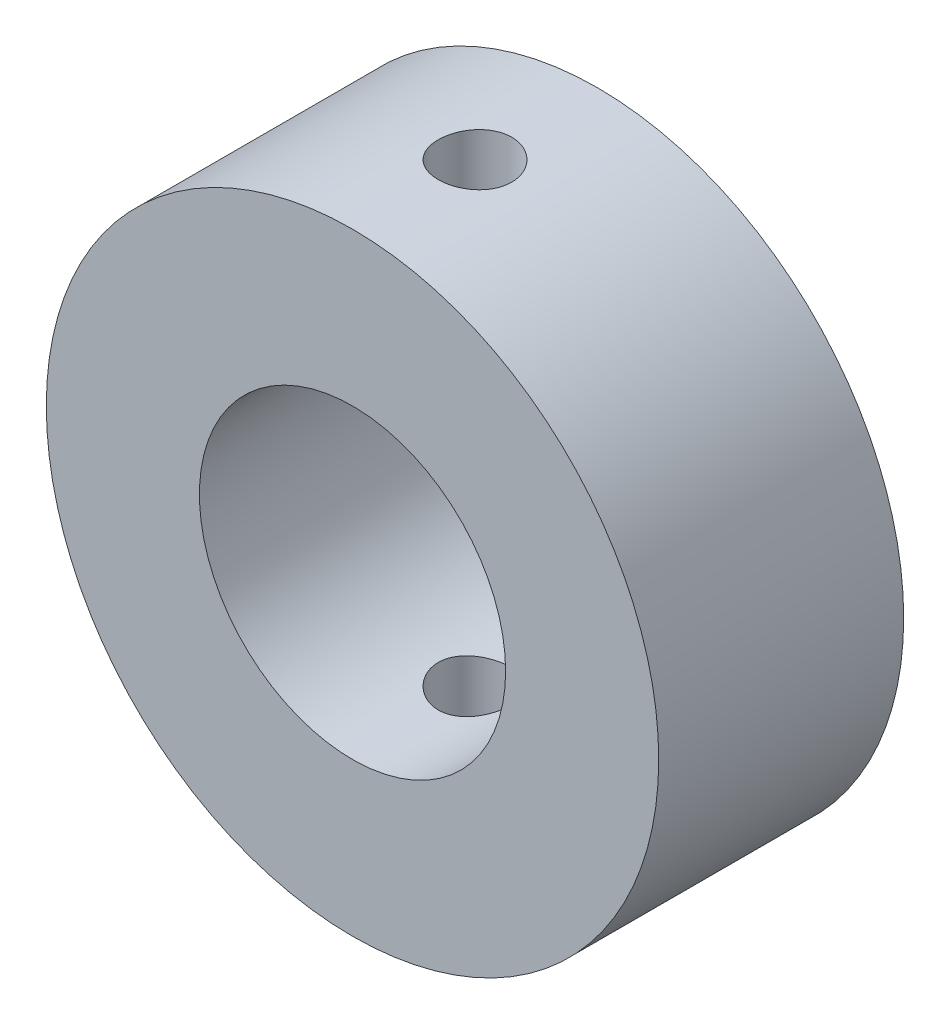
ISO-10303-21;
HEADER;
FILE_DESCRIPTION(('STEP AP214'),'2;1');
FILE_NAME('part.step','',(''),(''),'','','');
FILE_SCHEMA(('AUTOMOTIVE_DESIGN { 1 0 10303 214 1 1 1 1 }'));
ENDSEC;
DATA;
#1=APPLICATION_CONTEXT('core data for automotive mechanical design processes');
#2=APPLICATION_PROTOCOL_DEFINITION('international standard','automotive_design',2000,#1);
#3=PRODUCT_CONTEXT('',#1,'mechanical');
#4=PRODUCT('Part','Part','',(#3));
#5=PRODUCT_RELATED_PRODUCT_CATEGORY('part','',(#4));
#6=PRODUCT_DEFINITION_FORMATION('','',#4);
#7=PRODUCT_DEFINITION_CONTEXT('part definition',#1,'design');
#8=PRODUCT_DEFINITION('design','',#6,#7);
#9=PRODUCT_DEFINITION_SHAPE('','',#8);
#10=(LENGTH_UNIT() NAMED_UNIT(*) SI_UNIT(.MILLI.,.METRE.));
#11=(NAMED_UNIT(*) PLANE_ANGLE_UNIT() SI_UNIT($,.RADIAN.));
#12=(NAMED_UNIT(*) SI_UNIT($,.STERADIAN.) SOLID_ANGLE_UNIT());
#13=UNCERTAINTY_MEASURE_WITH_UNIT(LENGTH_MEASURE(1.E-05),#10,'distance_accuracy_value','');
#14=(GEOMETRIC_REPRESENTATION_CONTEXT(3) GLOBAL_UNCERTAINTY_ASSIGNED_CONTEXT((#13)) GLOBAL_UNIT_ASSIGNED_CONTEXT((#10,
#11,#12)) REPRESENTATION_CONTEXT('',''));
#15=CARTESIAN_POINT('',(0.,0.,0.));
#16=DIRECTION('',(0.,0.,1.));
#17=DIRECTION('',(1.,0.,0.));
#18=AXIS2_PLACEMENT_3D('',#15,#16,#17);
#19=CARTESIAN_POINT('',(0.,0.,20.));
#20=DIRECTION('',(0.,0.,1.));
#21=DIRECTION('',(1.,0.,0.));
#22=AXIS2_PLACEMENT_3D('',#19,#20,#21);
#23=PLANE('',#22);
#24=CARTESIAN_POINT('',(0.,0.,20.));
#25=DIRECTION('',(0.,0.,1.));
#26=DIRECTION('',(1.,0.,0.));
#27=AXIS2_PLACEMENT_3D('',#24,#25,#26);
#28=CIRCLE('',#27,25.);
#29=CARTESIAN_POINT('',(25.,0.,20.));
#30=VERTEX_POINT('',#29);
#31=EDGE_CURVE('E10',#30,#30,#28,.T.);
#32=ORIENTED_EDGE('',*,*,#31,.T.);
#33=EDGE_LOOP('',(#32));
#34=FACE_BOUND('',#33,.T.);
#35=CARTESIAN_POINT('',(0.,0.,20.));
#36=DIRECTION('',(0.,0.,1.));
#37=DIRECTION('',(1.,0.,0.));
#38=AXIS2_PLACEMENT_3D('',#35,#36,#37);
#39=CIRCLE('',#38,12.5);
#40=CARTESIAN_POINT('',(12.5,0.,20.));
#41=VERTEX_POINT('',#40);
#42=EDGE_CURVE('E51',#41,#41,#39,.T.);
#43=ORIENTED_EDGE('',*,*,#42,.F.);
#44=EDGE_LOOP('',(#43));
#45=FACE_BOUND('',#44,.T.);
#46=ADVANCED_FACE('F32',(#34,#45),#23,.T.);
#47=CARTESIAN_POINT('',(0.,0.,0.));
#48=DIRECTION('',(0.,0.,1.));
#49=DIRECTION('',(1.,0.,0.));
#50=AXIS2_PLACEMENT_3D('',#47,#48,#49);
#51=PLANE('',#50);
#52=CARTESIAN_POINT('',(0.,0.,0.));
#53=DIRECTION('',(0.,0.,1.));
#54=DIRECTION('',(1.,0.,0.));
#55=AXIS2_PLACEMENT_3D('',#52,#53,#54);
#56=CIRCLE('',#55,25.);
#57=CARTESIAN_POINT('',(25.,0.,0.));
#58=VERTEX_POINT('',#57);
#59=EDGE_CURVE('E46',#58,#58,#56,.T.);
#60=ORIENTED_EDGE('',*,*,#59,.F.);
#61=EDGE_LOOP('',(#60));
#62=FACE_BOUND('',#61,.T.);
#63=CARTESIAN_POINT('',(0.,0.,0.));
#64=DIRECTION('',(0.,0.,1.));
#65=DIRECTION('',(1.,0.,0.));
#66=AXIS2_PLACEMENT_3D('',#63,#64,#65);
#67=CIRCLE('',#66,12.5);
#68=CARTESIAN_POINT('',(12.5,0.,0.));
#69=VERTEX_POINT('',#68);
#70=EDGE_CURVE('E54',#69,#69,#67,.T.);
#71=ORIENTED_EDGE('',*,*,#70,.T.);
#72=EDGE_LOOP('',(#71));
#73=FACE_BOUND('',#72,.T.);
#74=ADVANCED_FACE('F90',(#62,#73),#51,.F.);
#75=CARTESIAN_POINT('',(0.,0.,20.));
#76=DIRECTION('',(0.,0.,-1.));
#77=DIRECTION('',(-1.,0.,0.));
#78=AXIS2_PLACEMENT_3D('',#75,#76,#77);
#79=CYLINDRICAL_SURFACE('',#78,25.);
#80=CARTESIAN_POINT('',(0.,-25.,13.));
#81=CARTESIAN_POINT('',(0.167864047107699,-24.9999977357459,12.9999928360586));
#82=CARTESIAN_POINT('',(0.335834317331191,-24.9982914200408,12.9858633413073));
#83=CARTESIAN_POINT('',(0.66710457130825,-24.991648705422,12.9297189358446));
#84=CARTESIAN_POINT('',(0.830399429590069,-24.9867088933728,12.8876745587494));
#85=CARTESIAN_POINT('',(1.14747479534053,-24.9741559265426,12.776953723474));
#86=CARTESIAN_POINT('',(1.30126148759225,-24.9665445315309,12.7082947931758));
#87=CARTESIAN_POINT('',(1.595099157832,-24.9494959264345,12.5463312649167));
#88=CARTESIAN_POINT('',(1.73515256713516,-24.9400590404141,12.4530310402467));
#89=CARTESIAN_POINT('',(1.99829131534451,-24.920360105442,12.2439251380248));
#90=CARTESIAN_POINT('',(2.1212966913072,-24.9100945030904,12.1280191598881));
#91=CARTESIAN_POINT('',(2.34615931038342,-24.8899239397152,11.8772070351121));
#92=CARTESIAN_POINT('',(2.44801549826474,-24.8800189967068,11.7422999409814));
#93=CARTESIAN_POINT('',(2.62798342873896,-24.8616560370405,11.4567991747016));
#94=CARTESIAN_POINT('',(2.7060207567257,-24.8532025903971,11.3061582754199));
#95=CARTESIAN_POINT('',(2.8356605730156,-24.8387461344686,10.9937912978913));
#96=CARTESIAN_POINT('',(2.88726398696776,-24.8327430393798,10.8320656080307));
#97=CARTESIAN_POINT('',(2.96232930045399,-24.8239006073737,10.5029471406886));
#98=CARTESIAN_POINT('',(2.98592577987646,-24.8210461452543,10.3355854715723));
#99=CARTESIAN_POINT('',(3.0047237521967,-24.8187777690611,9.99925506363583));
#100=CARTESIAN_POINT('',(2.99992630052848,-24.8193637271033,9.83028638478303));
#101=CARTESIAN_POINT('',(2.96218316078668,-24.8238961466306,9.49647403521565));
#102=CARTESIAN_POINT('',(2.92938543222303,-24.8278249434675,9.33161336131982));
#103=CARTESIAN_POINT('',(2.83680346170067,-24.8385728087608,9.00975297217864));
#104=CARTESIAN_POINT('',(2.77701871225814,-24.8453919315688,8.85275340482101));
#105=CARTESIAN_POINT('',(2.63199980699862,-24.8611722079476,8.55061053176089));
#106=CARTESIAN_POINT('',(2.54670106203925,-24.8701387862198,8.40549852164644));
#107=CARTESIAN_POINT('',(2.35312173169469,-24.8891993987901,8.13159278908424));
#108=CARTESIAN_POINT('',(2.24484017723157,-24.8992934806213,8.00279975509743));
#109=CARTESIAN_POINT('',(2.0075475556218,-24.9195503308637,7.76432891563562));
#110=CARTESIAN_POINT('',(1.87840890051216,-24.929713127424,7.65477803014294));
#111=CARTESIAN_POINT('',(1.60350795893872,-24.9489020798549,7.45888847899969));
#112=CARTESIAN_POINT('',(1.45774563908005,-24.9579282334421,7.37254985998085));
#113=CARTESIAN_POINT('',(1.15363930826285,-24.9738318861702,7.22553671436034));
#114=CARTESIAN_POINT('',(0.995291578715591,-24.9807087472809,7.16486980666956));
#115=CARTESIAN_POINT('',(0.67055602227344,-24.991533065309,7.0710212621491));
#116=CARTESIAN_POINT('',(0.504168542441623,-24.9954806485584,7.03783843999552));
#117=CARTESIAN_POINT('',(0.169174396374217,-24.9999852500304,7.00006374450231));
#118=CARTESIAN_POINT('',(0.000587720432051526,-25.0005630093753,6.9952969675993));
#119=CARTESIAN_POINT('',(-0.33498206824326,-24.9983187823231,7.01402857786827));
#120=CARTESIAN_POINT('',(-0.501965212327328,-24.9954968625308,7.03752641129535));
#121=CARTESIAN_POINT('',(-0.829074263928356,-24.9867833380686,7.11197496400309));
#122=CARTESIAN_POINT('',(-0.989219346369035,-24.9809010237909,7.16284261305008));
#123=CARTESIAN_POINT('',(-1.29870539768646,-24.9667255501792,7.29050070335358));
#124=CARTESIAN_POINT('',(-1.44804602592347,-24.9584323148759,7.36729196149009));
#125=CARTESIAN_POINT('',(-1.73246717766504,-24.9403085158695,7.54504291590243));
#126=CARTESIAN_POINT('',(-1.86747628962751,-24.9304708084643,7.64611613781082));
#127=CARTESIAN_POINT('',(-2.11867625152203,-24.9103817919419,7.86940084640817));
#128=CARTESIAN_POINT('',(-2.23486641472949,-24.9001304677484,7.99161310414795));
#129=CARTESIAN_POINT('',(-2.44574795226154,-24.8803059484942,8.25447561542769));
#130=CARTESIAN_POINT('',(-2.54032363231939,-24.8707365831307,8.39521901534385));
#131=CARTESIAN_POINT('',(-2.70449314429332,-24.8534214993383,8.69069502507556));
#132=CARTESIAN_POINT('',(-2.77408744356074,-24.8456757467943,8.84542737311824));
#133=CARTESIAN_POINT('',(-2.88612996668159,-24.8329105734502,9.1641106088947));
#134=CARTESIAN_POINT('',(-2.92864420159346,-24.8278845275633,9.32803801185939));
#135=CARTESIAN_POINT('',(-2.98553272163516,-24.8211085274587,9.66076896948507));
#136=CARTESIAN_POINT('',(-2.99990820526081,-24.8193584337106,9.82957231615732));
#137=CARTESIAN_POINT('',(-3.00009033817931,-24.819336326607,10.1661127296372));
#138=CARTESIAN_POINT('',(-2.98607873671351,-24.8210421863943,10.3338497257713));
#139=CARTESIAN_POINT('',(-2.93026848672089,-24.8276922947425,10.6645667863942));
#140=CARTESIAN_POINT('',(-2.88846982822067,-24.8326365444656,10.8275468491756));
#141=CARTESIAN_POINT('',(-2.77832739820545,-24.8451996524586,11.1441045388887));
#142=CARTESIAN_POINT('',(-2.70999165570539,-24.8528177016812,11.2976849934955));
#143=CARTESIAN_POINT('',(-2.5487328262801,-24.8698714539139,11.5912277470701));
#144=CARTESIAN_POINT('',(-2.45580952709445,-24.8793071726153,11.7311899284593));
#145=CARTESIAN_POINT('',(-2.24733689647205,-24.8990055122588,11.9944529401088));
#146=CARTESIAN_POINT('',(-2.1316520393015,-24.9092728581347,12.1176461032663));
#147=CARTESIAN_POINT('',(-1.88122093334447,-24.9294354968169,12.342942479566));
#148=CARTESIAN_POINT('',(-1.74647018263601,-24.939330701051,12.4450406976292));
#149=CARTESIAN_POINT('',(-1.46119322465137,-24.9576721709324,12.6255505779989));
#150=CARTESIAN_POINT('',(-1.31061323462417,-24.966113221621,12.7038777257223));
#151=CARTESIAN_POINT('',(-0.99842275168531,-24.9805418519727,12.8340237644426));
#152=CARTESIAN_POINT('',(-0.836824564362144,-24.9865321180615,12.8858716961804));
#153=CARTESIAN_POINT('',(-0.561977101236697,-24.9939268325999,12.9490634203381));
#154=CARTESIAN_POINT('',(-0.450466569753487,-24.996193279433,12.9681374838864));
#155=CARTESIAN_POINT('',(-0.225986735693694,-24.9992306204204,12.993608143491));
#156=CARTESIAN_POINT('',(-0.113017442753625,-25.0000015244492,13.0000048232505));
#157=CARTESIAN_POINT('',(0.,-25.,13.));
#158=B_SPLINE_CURVE_WITH_KNOTS('',3,(#80,#81,#82,#83,#84,#85,#86,#87,#88,#89,#90,#91,#92,#93,
#94,#95,#96,#97,#98,#99,#100,#101,#102,#103,#104,#105,#106,#107,#108,#109,#110,#111,#112,#113,
#114,#115,#116,#117,#118,#119,#120,#121,#122,#123,#124,#125,#126,#127,#128,#129,#130,#131,#132,
#133,#134,#135,#136,#137,#138,#139,#140,#141,#142,#143,#144,#145,#146,#147,#148,#149,#150,#151,
#152,#153,#154,#155,#156,#157),.UNSPECIFIED.,.T.,.F.,(4,2,2,2,2,2,2,2,2,2,2,2,2,2,2,2,2,2,2,2,2,
2,2,2,2,2,2,2,2,2,2,2,2,2,2,2,2,2,4),(0.,0.503179350956159,1.00689069408623,1.5102708637556,
2.01356175441693,2.51913872195878,3.02474090904883,3.53190689496397,4.03905511999113,
4.54375638343279,5.0484388866848,5.55047092912253,6.05251241253396,6.55583573710536,
7.05918028869262,7.56572944640317,8.07227962172601,8.57898002694278,9.08565857822619,
9.58921522624226,10.0927620090108,10.5947890255775,11.0968318630167,11.6012692178556,
12.1057249760356,12.6128207581672,13.119907053063,13.6257524826489,14.1315763666154,
14.6341719319229,15.1367676776234,15.6392114771388,16.1416596143122,16.6471952402032,
17.1528504352009,17.6602829023946,18.1671576479275,18.5059342945627,18.8447087043981),.UNSPECIFIED.);
#159=CARTESIAN_POINT('',(0.,-25.,13.));
#160=VERTEX_POINT('',#159);
#161=EDGE_CURVE('E79',#160,#160,#158,.T.);
#162=ORIENTED_EDGE('',*,*,#161,.T.);
#163=EDGE_LOOP('',(#162));
#164=FACE_BOUND('',#163,.T.);
#165=CARTESIAN_POINT('',(0.,25.,13.));
#166=CARTESIAN_POINT('',(-0.167864047107699,24.9999977357459,12.9999928360586));
#167=CARTESIAN_POINT('',(-0.335834317331191,24.9982914200408,12.9858633413073));
#168=CARTESIAN_POINT('',(-0.66710457130825,24.991648705422,12.9297189358446));
#169=CARTESIAN_POINT('',(-0.830399429590069,24.9867088933728,12.8876745587494));
#170=CARTESIAN_POINT('',(-1.14747479534053,24.9741559265426,12.776953723474));
#171=CARTESIAN_POINT('',(-1.30126148759225,24.9665445315309,12.7082947931758));
#172=CARTESIAN_POINT('',(-1.595099157832,24.9494959264345,12.5463312649167));
#173=CARTESIAN_POINT('',(-1.73515256713516,24.9400590404141,12.4530310402467));
#174=CARTESIAN_POINT('',(-1.99829131534451,24.920360105442,12.2439251380248));
#175=CARTESIAN_POINT('',(-2.1212966913072,24.9100945030904,12.1280191598881));
#176=CARTESIAN_POINT('',(-2.34615931038342,24.8899239397152,11.8772070351121));
#177=CARTESIAN_POINT('',(-2.44801549826474,24.8800189967068,11.7422999409814));
#178=CARTESIAN_POINT('',(-2.62798342873896,24.8616560370405,11.4567991747016));
#179=CARTESIAN_POINT('',(-2.7060207567257,24.8532025903971,11.3061582754199));
#180=CARTESIAN_POINT('',(-2.8356605730156,24.8387461344686,10.9937912978913));
#181=CARTESIAN_POINT('',(-2.88726398696776,24.8327430393798,10.8320656080307));
#182=CARTESIAN_POINT('',(-2.96232930045399,24.8239006073737,10.5029471406886));
#183=CARTESIAN_POINT('',(-2.98592577987646,24.8210461452543,10.3355854715723));
#184=CARTESIAN_POINT('',(-3.0047237521967,24.8187777690611,9.99925506363583));
#185=CARTESIAN_POINT('',(-2.99992630052848,24.8193637271033,9.83028638478303));
#186=CARTESIAN_POINT('',(-2.96218316078668,24.8238961466306,9.49647403521565));
#187=CARTESIAN_POINT('',(-2.92938543222303,24.8278249434675,9.33161336131982));
#188=CARTESIAN_POINT('',(-2.83680346170067,24.8385728087608,9.00975297217864));
#189=CARTESIAN_POINT('',(-2.77701871225814,24.8453919315688,8.85275340482101));
#190=CARTESIAN_POINT('',(-2.63199980699862,24.8611722079476,8.55061053176089));
#191=CARTESIAN_POINT('',(-2.54670106203925,24.8701387862198,8.40549852164644));
#192=CARTESIAN_POINT('',(-2.35312173169469,24.8891993987901,8.13159278908424));
#193=CARTESIAN_POINT('',(-2.24484017723157,24.8992934806213,8.00279975509743));
#194=CARTESIAN_POINT('',(-2.0075475556218,24.9195503308637,7.76432891563562));
#195=CARTESIAN_POINT('',(-1.87840890051216,24.929713127424,7.65477803014294));
#196=CARTESIAN_POINT('',(-1.60350795893872,24.9489020798549,7.45888847899969));
#197=CARTESIAN_POINT('',(-1.45774563908005,24.9579282334421,7.37254985998085));
#198=CARTESIAN_POINT('',(-1.15363930826285,24.9738318861702,7.22553671436034));
#199=CARTESIAN_POINT('',(-0.995291578715591,24.9807087472809,7.16486980666956));
#200=CARTESIAN_POINT('',(-0.67055602227344,24.991533065309,7.0710212621491));
#201=CARTESIAN_POINT('',(-0.504168542441623,24.9954806485584,7.03783843999552));
#202=CARTESIAN_POINT('',(-0.169174396374217,24.9999852500304,7.00006374450231));
#203=CARTESIAN_POINT('',(-0.000587720432051526,25.0005630093753,6.9952969675993));
#204=CARTESIAN_POINT('',(0.33498206824326,24.9983187823231,7.01402857786827));
#205=CARTESIAN_POINT('',(0.501965212327328,24.9954968625308,7.03752641129535));
#206=CARTESIAN_POINT('',(0.829074263928356,24.9867833380686,7.11197496400309));
#207=CARTESIAN_POINT('',(0.989219346369035,24.9809010237909,7.16284261305008));
#208=CARTESIAN_POINT('',(1.29870539768646,24.9667255501792,7.29050070335358));
#209=CARTESIAN_POINT('',(1.44804602592347,24.9584323148759,7.36729196149009));
#210=CARTESIAN_POINT('',(1.73246717766504,24.9403085158695,7.54504291590243));
#211=CARTESIAN_POINT('',(1.86747628962751,24.9304708084643,7.64611613781082));
#212=CARTESIAN_POINT('',(2.11867625152203,24.9103817919419,7.86940084640817));
#213=CARTESIAN_POINT('',(2.23486641472949,24.9001304677484,7.99161310414795));
#214=CARTESIAN_POINT('',(2.44574795226154,24.8803059484942,8.25447561542769));
#215=CARTESIAN_POINT('',(2.54032363231939,24.8707365831307,8.39521901534385));
#216=CARTESIAN_POINT('',(2.70449314429332,24.8534214993383,8.69069502507556));
#217=CARTESIAN_POINT('',(2.77408744356074,24.8456757467943,8.84542737311824));
#218=CARTESIAN_POINT('',(2.88612996668159,24.8329105734502,9.1641106088947));
#219=CARTESIAN_POINT('',(2.92864420159346,24.8278845275633,9.32803801185939));
#220=CARTESIAN_POINT('',(2.98553272163516,24.8211085274587,9.66076896948507));
#221=CARTESIAN_POINT('',(2.99990820526081,24.8193584337106,9.82957231615732));
#222=CARTESIAN_POINT('',(3.00009033817931,24.819336326607,10.1661127296372));
#223=CARTESIAN_POINT('',(2.98607873671351,24.8210421863943,10.3338497257713));
#224=CARTESIAN_POINT('',(2.93026848672089,24.8276922947425,10.6645667863942));
#225=CARTESIAN_POINT('',(2.88846982822067,24.8326365444656,10.8275468491756));
#226=CARTESIAN_POINT('',(2.77832739820545,24.8451996524586,11.1441045388887));
#227=CARTESIAN_POINT('',(2.70999165570539,24.8528177016812,11.2976849934955));
#228=CARTESIAN_POINT('',(2.5487328262801,24.8698714539139,11.5912277470701));
#229=CARTESIAN_POINT('',(2.45580952709445,24.8793071726153,11.7311899284593));
#230=CARTESIAN_POINT('',(2.24733689647205,24.8990055122588,11.9944529401088));
#231=CARTESIAN_POINT('',(2.1316520393015,24.9092728581347,12.1176461032663));
#232=CARTESIAN_POINT('',(1.88122093334447,24.9294354968169,12.342942479566));
#233=CARTESIAN_POINT('',(1.74647018263601,24.939330701051,12.4450406976292));
#234=CARTESIAN_POINT('',(1.46119322465137,24.9576721709324,12.6255505779989));
#235=CARTESIAN_POINT('',(1.31061323462417,24.966113221621,12.7038777257223));
#236=CARTESIAN_POINT('',(0.99842275168531,24.9805418519727,12.8340237644426));
#237=CARTESIAN_POINT('',(0.836824564362144,24.9865321180615,12.8858716961804));
#238=CARTESIAN_POINT('',(0.561977101236697,24.9939268325999,12.9490634203381));
#239=CARTESIAN_POINT('',(0.450466569753487,24.996193279433,12.9681374838864));
#240=CARTESIAN_POINT('',(0.225986735693694,24.9992306204204,12.993608143491));
#241=CARTESIAN_POINT('',(0.113017442753625,25.0000015244492,13.0000048232505));
#242=CARTESIAN_POINT('',(0.,25.,13.));
#243=B_SPLINE_CURVE_WITH_KNOTS('',3,(#165,#166,#167,#168,#169,#170,#171,#172,#173,#174,#175,
#176,#177,#178,#179,#180,#181,#182,#183,#184,#185,#186,#187,#188,#189,#190,#191,#192,#193,#194,
#195,#196,#197,#198,#199,#200,#201,#202,#203,#204,#205,#206,#207,#208,#209,#210,#211,#212,#213,
#214,#215,#216,#217,#218,#219,#220,#221,#222,#223,#224,#225,#226,#227,#228,#229,#230,#231,#232,
#233,#234,#235,#236,#237,#238,#239,#240,#241,#242),.UNSPECIFIED.,.T.,.F.,(4,2,2,2,2,2,2,2,2,2,2,
2,2,2,2,2,2,2,2,2,2,2,2,2,2,2,2,2,2,2,2,2,2,2,2,2,2,2,4),(0.,0.503179350956159,1.00689069408623,
1.5102708637556,2.01356175441693,2.51913872195878,3.02474090904883,3.53190689496397,
4.03905511999113,4.54375638343279,5.0484388866848,5.55047092912253,6.05251241253396,
6.55583573710536,7.05918028869262,7.56572944640317,8.07227962172601,8.57898002694278,
9.08565857822619,9.58921522624226,10.0927620090108,10.5947890255775,11.0968318630167,
11.6012692178556,12.1057249760356,12.6128207581672,13.119907053063,13.6257524826489,
14.1315763666154,14.6341719319229,15.1367676776234,15.6392114771388,16.1416596143122,
16.6471952402032,17.1528504352009,17.6602829023946,18.1671576479275,18.5059342945627,
18.8447087043981),.UNSPECIFIED.);
#244=CARTESIAN_POINT('',(0.,25.,13.));
#245=VERTEX_POINT('',#244);
#246=EDGE_CURVE('E74',#245,#245,#243,.T.);
#247=ORIENTED_EDGE('',*,*,#246,.T.);
#248=EDGE_LOOP('',(#247));
#249=FACE_BOUND('',#248,.T.);
#250=ORIENTED_EDGE('',*,*,#31,.F.);
#251=EDGE_LOOP('',(#250));
#252=FACE_BOUND('',#251,.T.);
#253=ORIENTED_EDGE('',*,*,#59,.T.);
#254=EDGE_LOOP('',(#253));
#255=FACE_BOUND('',#254,.T.);
#256=ADVANCED_FACE('F34',(#164,#249,#252,#255),#79,.T.);
#257=CARTESIAN_POINT('',(0.,0.,20.));
#258=DIRECTION('',(0.,0.,-1.));
#259=DIRECTION('',(-1.,0.,0.));
#260=AXIS2_PLACEMENT_3D('',#257,#258,#259);
#261=CYLINDRICAL_SURFACE('',#260,12.5);
#262=CARTESIAN_POINT('',(0.,-12.5,13.));
#263=CARTESIAN_POINT('',(0.165963929028716,-12.4999970714968,12.9999949759227));
#264=CARTESIAN_POINT('',(0.331985420928067,-12.4966615634859,12.9861815897639));
#265=CARTESIAN_POINT('',(0.65928429097138,-12.4836783946933,12.9313672604046));
#266=CARTESIAN_POINT('',(0.820558683214275,-12.4740268462166,12.8903495720053));
#267=CARTESIAN_POINT('',(1.13358839471402,-12.4494823208195,12.7825076654956));
#268=CARTESIAN_POINT('',(1.28535442324822,-12.4345953702841,12.7157131101424));
#269=CARTESIAN_POINT('',(1.57552517879763,-12.4011725442513,12.5583145635541));
#270=CARTESIAN_POINT('',(1.71392971475166,-12.3826366165873,12.4677102319227));
#271=CARTESIAN_POINT('',(1.97609263393972,-12.3435386014785,12.2634358216245));
#272=CARTESIAN_POINT('',(2.0995595210048,-12.3229472454311,12.1493972189507));
#273=CARTESIAN_POINT('',(2.32581080811943,-12.2822574370147,11.9022811309354));
#274=CARTESIAN_POINT('',(2.42859304624489,-12.2621590363612,11.769201657959));
#275=CARTESIAN_POINT('',(2.61189993555015,-12.224437969062,11.4855541669825));
#276=CARTESIAN_POINT('',(2.69210377047565,-12.2068525815312,11.3347734162412));
#277=CARTESIAN_POINT('',(2.82591582947333,-12.1765733412448,11.0213801648715));
#278=CARTESIAN_POINT('',(2.87952794169564,-12.1638787734309,10.8587693979768));
#279=CARTESIAN_POINT('',(2.95765058108663,-12.1451184675007,10.5295234267311));
#280=CARTESIAN_POINT('',(2.98268262400616,-12.1389341034343,10.3630188784745));
#281=CARTESIAN_POINT('',(3.00455808879087,-12.1335389605945,10.0280676203572));
#282=CARTESIAN_POINT('',(3.00140571682399,-12.1343271412568,9.85962120404308));
#283=CARTESIAN_POINT('',(2.96741912081942,-12.1426811387008,9.52952403398712));
#284=CARTESIAN_POINT('',(2.93720103400494,-12.1500960921292,9.36780543481044));
#285=CARTESIAN_POINT('',(2.85092141637189,-12.1706283738785,9.05180268335217));
#286=CARTESIAN_POINT('',(2.79485817372027,-12.1837460799133,8.89751902426557));
#287=CARTESIAN_POINT('',(2.65794121231782,-12.2143476734445,8.59908702191565));
#288=CARTESIAN_POINT('',(2.5768594824696,-12.2318714325758,8.45504754708331));
#289=CARTESIAN_POINT('',(2.39236688956383,-12.2692875046197,8.18239549927742));
#290=CARTESIAN_POINT('',(2.28895240342647,-12.2891802016137,8.05378543471489));
#291=CARTESIAN_POINT('',(2.05951493908847,-12.329732025739,7.81210642968126));
#292=CARTESIAN_POINT('',(1.93297064389908,-12.3503975788014,7.69953290093779));
#293=CARTESIAN_POINT('',(1.66255592459692,-12.3896951594929,7.49711528025362));
#294=CARTESIAN_POINT('',(1.51868504982141,-12.4083271342049,7.40727177970739));
#295=CARTESIAN_POINT('',(1.21702847718581,-12.4415394956922,7.25270277938722));
#296=CARTESIAN_POINT('',(1.05920278696054,-12.4561077058019,7.18805254376221));
#297=CARTESIAN_POINT('',(0.734497606078677,-12.4794620474154,7.08633492095141));
#298=CARTESIAN_POINT('',(0.567619713387663,-12.4882491958651,7.04926268237319));
#299=CARTESIAN_POINT('',(0.233787399651666,-12.4989027542709,7.00449793534796));
#300=CARTESIAN_POINT('',(0.0669284805450087,-12.5009282130753,6.99613010753843));
#301=CARTESIAN_POINT('',(-0.265804381586628,-12.4982807419474,7.0071667668509));
#302=CARTESIAN_POINT('',(-0.431678404764952,-12.4936083648176,7.02656896198723));
#303=CARTESIAN_POINT('',(-0.755422580108846,-12.4781916395217,7.09203697851638));
#304=CARTESIAN_POINT('',(-0.913370579311302,-12.4675301590363,7.1377391095738));
#305=CARTESIAN_POINT('',(-1.21935330013476,-12.4413335015664,7.25409819169526));
#306=CARTESIAN_POINT('',(-1.3673870666415,-12.4257978558334,7.3247575429781));
#307=CARTESIAN_POINT('',(-1.6520615099557,-12.3911910149582,7.49036659359785));
#308=CARTESIAN_POINT('',(-1.78847176740355,-12.3720653178033,7.58570071692437));
#309=CARTESIAN_POINT('',(-2.04359904096632,-12.3324936406987,7.79745692901341));
#310=CARTESIAN_POINT('',(-2.16231325074336,-12.3120474520734,7.91388235608078));
#311=CARTESIAN_POINT('',(-2.38142453789941,-12.2715742142771,8.16764083120855));
#312=CARTESIAN_POINT('',(-2.48134974047369,-12.2515669262668,8.3053851220821));
#313=CARTESIAN_POINT('',(-2.65666020824081,-12.2147538797452,8.59609042789673));
#314=CARTESIAN_POINT('',(-2.7320465722335,-12.1979479778962,8.74905076109347));
#315=CARTESIAN_POINT('',(-2.85558993518171,-12.1696189519335,9.06501251354399));
#316=CARTESIAN_POINT('',(-2.90390754385905,-12.1580647463107,9.22794820342123));
#317=CARTESIAN_POINT('',(-2.97238380283979,-12.1415072663683,9.55994618502069));
#318=CARTESIAN_POINT('',(-2.99254804274991,-12.1365026916888,9.72900725376177));
#319=CARTESIAN_POINT('',(-3.00387066449353,-12.1337046220624,10.0636707002806));
#320=CARTESIAN_POINT('',(-2.99578106592266,-12.1357241633848,10.2292464963267));
#321=CARTESIAN_POINT('',(-2.95253345626267,-12.1463176460425,10.5565997642237));
#322=CARTESIAN_POINT('',(-2.91737590900096,-12.1548914750658,10.7183773011114));
#323=CARTESIAN_POINT('',(-2.82138591303537,-12.1775274976748,11.0327975525482));
#324=CARTESIAN_POINT('',(-2.76068402045612,-12.191561756094,11.1854822725838));
#325=CARTESIAN_POINT('',(-2.61543373580583,-12.2235433612686,11.4786044138837));
#326=CARTESIAN_POINT('',(-2.53088229934855,-12.2414912075257,11.6190402685864));
#327=CARTESIAN_POINT('',(-2.33793007708464,-12.2798193255291,11.8873370001195));
#328=CARTESIAN_POINT('',(-2.22900267979018,-12.3002478697533,12.0148123230987));
#329=CARTESIAN_POINT('',(-1.99143074773237,-12.3409359831145,12.2499199880519));
#330=CARTESIAN_POINT('',(-1.86278158874234,-12.361195511444,12.3575476632102));
#331=CARTESIAN_POINT('',(-1.5868829988014,-12.3996570299581,12.5516092595547));
#332=CARTESIAN_POINT('',(-1.43936414359402,-12.4178200201219,12.637668405442));
#333=CARTESIAN_POINT('',(-1.13153622828567,-12.4496380610582,12.7836295327479));
#334=CARTESIAN_POINT('',(-0.971236973691221,-12.4632965272855,12.8435513433916));
#335=CARTESIAN_POINT('',(-0.675887025694767,-12.4824059901497,12.9260386251378));
#336=CARTESIAN_POINT('',(-0.542312066268422,-12.4889599449579,12.9537166157857));
#337=CARTESIAN_POINT('',(-0.272504227478249,-12.4977580149525,12.9906987808519));
#338=CARTESIAN_POINT('',(-0.136271517915777,-12.5000024045682,13.0000041252255));
#339=CARTESIAN_POINT('',(0.,-12.5,13.));
#340=B_SPLINE_CURVE_WITH_KNOTS('',3,(#262,#263,#264,#265,#266,#267,#268,#269,#270,#271,#272,
#273,#274,#275,#276,#277,#278,#279,#280,#281,#282,#283,#284,#285,#286,#287,#288,#289,#290,#291,
#292,#293,#294,#295,#296,#297,#298,#299,#300,#301,#302,#303,#304,#305,#306,#307,#308,#309,#310,
#311,#312,#313,#314,#315,#316,#317,#318,#319,#320,#321,#322,#323,#324,#325,#326,#327,#328,#329,
#330,#331,#332,#333,#334,#335,#336,#337,#338,#339),.UNSPECIFIED.,.T.,.F.,(4,2,2,2,2,2,2,2,2,2,2,
2,2,2,2,2,2,2,2,2,2,2,2,2,2,2,2,2,2,2,2,2,2,2,2,2,2,2,4),(0.,0.497392599366678,
0.995091645758824,1.49221966408501,1.98935478998519,2.49500570148357,3.00070943533306,
3.51327262050849,4.02576083835037,4.52873995359111,5.03164400680465,5.52338274964839,
6.01515406709138,6.51154667521171,7.00801987450003,7.51749958381934,8.0269925475217,
8.53799614678203,9.04890983140415,9.54771776810826,10.0464845383097,10.5385143736981,
11.0305915421211,11.5308523313794,12.031192370573,12.5427824523192,13.0543496229377,
13.5628484119093,14.0712462285018,14.5662165454702,15.0611783809799,15.5536406351284,
16.0461657803879,16.5505844610431,17.0551215958269,17.5678974206352,18.0802835459069,
18.4887142303991,18.897118905514),.UNSPECIFIED.);
#341=CARTESIAN_POINT('',(0.,-12.5,13.));
#342=VERTEX_POINT('',#341);
#343=EDGE_CURVE('E37',#342,#342,#340,.T.);
#344=ORIENTED_EDGE('',*,*,#343,.F.);
#345=EDGE_LOOP('',(#344));
#346=FACE_BOUND('',#345,.T.);
#347=CARTESIAN_POINT('',(0.,12.5,13.));
#348=CARTESIAN_POINT('',(-0.165963929028716,12.4999970714968,12.9999949759227));
#349=CARTESIAN_POINT('',(-0.331985420928067,12.4966615634859,12.9861815897639));
#350=CARTESIAN_POINT('',(-0.65928429097138,12.4836783946933,12.9313672604046));
#351=CARTESIAN_POINT('',(-0.820558683214275,12.4740268462166,12.8903495720053));
#352=CARTESIAN_POINT('',(-1.13358839471402,12.4494823208195,12.7825076654956));
#353=CARTESIAN_POINT('',(-1.28535442324822,12.4345953702841,12.7157131101424));
#354=CARTESIAN_POINT('',(-1.57552517879763,12.4011725442513,12.5583145635541));
#355=CARTESIAN_POINT('',(-1.71392971475166,12.3826366165873,12.4677102319227));
#356=CARTESIAN_POINT('',(-1.97609263393972,12.3435386014785,12.2634358216245));
#357=CARTESIAN_POINT('',(-2.0995595210048,12.3229472454311,12.1493972189507));
#358=CARTESIAN_POINT('',(-2.32581080811943,12.2822574370147,11.9022811309354));
#359=CARTESIAN_POINT('',(-2.42859304624489,12.2621590363612,11.769201657959));
#360=CARTESIAN_POINT('',(-2.61189993555015,12.224437969062,11.4855541669825));
#361=CARTESIAN_POINT('',(-2.69210377047565,12.2068525815312,11.3347734162412));
#362=CARTESIAN_POINT('',(-2.82591582947333,12.1765733412448,11.0213801648715));
#363=CARTESIAN_POINT('',(-2.87952794169564,12.1638787734309,10.8587693979768));
#364=CARTESIAN_POINT('',(-2.95765058108663,12.1451184675007,10.5295234267311));
#365=CARTESIAN_POINT('',(-2.98268262400616,12.1389341034343,10.3630188784745));
#366=CARTESIAN_POINT('',(-3.00455808879087,12.1335389605945,10.0280676203572));
#367=CARTESIAN_POINT('',(-3.00140571682399,12.1343271412568,9.85962120404308));
#368=CARTESIAN_POINT('',(-2.96741912081942,12.1426811387008,9.52952403398712));
#369=CARTESIAN_POINT('',(-2.93720103400494,12.1500960921292,9.36780543481044));
#370=CARTESIAN_POINT('',(-2.85092141637189,12.1706283738785,9.05180268335217));
#371=CARTESIAN_POINT('',(-2.79485817372027,12.1837460799133,8.89751902426557));
#372=CARTESIAN_POINT('',(-2.65794121231782,12.2143476734445,8.59908702191565));
#373=CARTESIAN_POINT('',(-2.5768594824696,12.2318714325758,8.45504754708331));
#374=CARTESIAN_POINT('',(-2.39236688956383,12.2692875046197,8.18239549927742));
#375=CARTESIAN_POINT('',(-2.28895240342647,12.2891802016137,8.05378543471489));
#376=CARTESIAN_POINT('',(-2.05951493908847,12.329732025739,7.81210642968126));
#377=CARTESIAN_POINT('',(-1.93297064389908,12.3503975788014,7.69953290093779));
#378=CARTESIAN_POINT('',(-1.66255592459692,12.3896951594929,7.49711528025362));
#379=CARTESIAN_POINT('',(-1.51868504982141,12.4083271342049,7.40727177970739));
#380=CARTESIAN_POINT('',(-1.21702847718581,12.4415394956922,7.25270277938722));
#381=CARTESIAN_POINT('',(-1.05920278696054,12.4561077058019,7.18805254376221));
#382=CARTESIAN_POINT('',(-0.734497606078677,12.4794620474154,7.08633492095141));
#383=CARTESIAN_POINT('',(-0.567619713387663,12.4882491958651,7.04926268237319));
#384=CARTESIAN_POINT('',(-0.233787399651666,12.4989027542709,7.00449793534796));
#385=CARTESIAN_POINT('',(-0.0669284805450087,12.5009282130753,6.99613010753843));
#386=CARTESIAN_POINT('',(0.265804381586628,12.4982807419474,7.0071667668509));
#387=CARTESIAN_POINT('',(0.431678404764952,12.4936083648176,7.02656896198723));
#388=CARTESIAN_POINT('',(0.755422580108846,12.4781916395217,7.09203697851638));
#389=CARTESIAN_POINT('',(0.913370579311302,12.4675301590363,7.1377391095738));
#390=CARTESIAN_POINT('',(1.21935330013476,12.4413335015664,7.25409819169526));
#391=CARTESIAN_POINT('',(1.3673870666415,12.4257978558334,7.3247575429781));
#392=CARTESIAN_POINT('',(1.6520615099557,12.3911910149582,7.49036659359785));
#393=CARTESIAN_POINT('',(1.78847176740355,12.3720653178033,7.58570071692437));
#394=CARTESIAN_POINT('',(2.04359904096632,12.3324936406987,7.79745692901341));
#395=CARTESIAN_POINT('',(2.16231325074336,12.3120474520734,7.91388235608078));
#396=CARTESIAN_POINT('',(2.38142453789941,12.2715742142771,8.16764083120855));
#397=CARTESIAN_POINT('',(2.48134974047369,12.2515669262668,8.3053851220821));
#398=CARTESIAN_POINT('',(2.65666020824081,12.2147538797452,8.59609042789673));
#399=CARTESIAN_POINT('',(2.7320465722335,12.1979479778962,8.74905076109347));
#400=CARTESIAN_POINT('',(2.85558993518171,12.1696189519335,9.06501251354399));
#401=CARTESIAN_POINT('',(2.90390754385905,12.1580647463107,9.22794820342123));
#402=CARTESIAN_POINT('',(2.97238380283979,12.1415072663683,9.55994618502069));
#403=CARTESIAN_POINT('',(2.99254804274991,12.1365026916888,9.72900725376177));
#404=CARTESIAN_POINT('',(3.00387066449353,12.1337046220624,10.0636707002806));
#405=CARTESIAN_POINT('',(2.99578106592266,12.1357241633848,10.2292464963267));
#406=CARTESIAN_POINT('',(2.95253345626267,12.1463176460425,10.5565997642237));
#407=CARTESIAN_POINT('',(2.91737590900096,12.1548914750658,10.7183773011114));
#408=CARTESIAN_POINT('',(2.82138591303537,12.1775274976748,11.0327975525482));
#409=CARTESIAN_POINT('',(2.76068402045612,12.191561756094,11.1854822725838));
#410=CARTESIAN_POINT('',(2.61543373580583,12.2235433612686,11.4786044138837));
#411=CARTESIAN_POINT('',(2.53088229934855,12.2414912075257,11.6190402685864));
#412=CARTESIAN_POINT('',(2.33793007708464,12.2798193255291,11.8873370001195));
#413=CARTESIAN_POINT('',(2.22900267979018,12.3002478697533,12.0148123230987));
#414=CARTESIAN_POINT('',(1.99143074773237,12.3409359831145,12.2499199880519));
#415=CARTESIAN_POINT('',(1.86278158874234,12.361195511444,12.3575476632102));
#416=CARTESIAN_POINT('',(1.5868829988014,12.3996570299581,12.5516092595547));
#417=CARTESIAN_POINT('',(1.43936414359402,12.4178200201219,12.637668405442));
#418=CARTESIAN_POINT('',(1.13153622828567,12.4496380610582,12.7836295327479));
#419=CARTESIAN_POINT('',(0.971236973691221,12.4632965272855,12.8435513433916));
#420=CARTESIAN_POINT('',(0.675887025694767,12.4824059901497,12.9260386251378));
#421=CARTESIAN_POINT('',(0.542312066268422,12.4889599449579,12.9537166157857));
#422=CARTESIAN_POINT('',(0.272504227478249,12.4977580149525,12.9906987808519));
#423=CARTESIAN_POINT('',(0.136271517915777,12.5000024045682,13.0000041252255));
#424=CARTESIAN_POINT('',(0.,12.5,13.));
#425=B_SPLINE_CURVE_WITH_KNOTS('',3,(#347,#348,#349,#350,#351,#352,#353,#354,#355,#356,#357,
#358,#359,#360,#361,#362,#363,#364,#365,#366,#367,#368,#369,#370,#371,#372,#373,#374,#375,#376,
#377,#378,#379,#380,#381,#382,#383,#384,#385,#386,#387,#388,#389,#390,#391,#392,#393,#394,#395,
#396,#397,#398,#399,#400,#401,#402,#403,#404,#405,#406,#407,#408,#409,#410,#411,#412,#413,#414,
#415,#416,#417,#418,#419,#420,#421,#422,#423,#424),.UNSPECIFIED.,.T.,.F.,(4,2,2,2,2,2,2,2,2,2,2,
2,2,2,2,2,2,2,2,2,2,2,2,2,2,2,2,2,2,2,2,2,2,2,2,2,2,2,4),(0.,0.497392599366678,
0.995091645758824,1.49221966408501,1.98935478998519,2.49500570148357,3.00070943533306,
3.51327262050849,4.02576083835037,4.52873995359111,5.03164400680465,5.52338274964839,
6.01515406709138,6.51154667521171,7.00801987450003,7.51749958381934,8.0269925475217,
8.53799614678203,9.04890983140415,9.54771776810826,10.0464845383097,10.5385143736981,
11.0305915421211,11.5308523313794,12.031192370573,12.5427824523192,13.0543496229377,
13.5628484119093,14.0712462285018,14.5662165454702,15.0611783809799,15.5536406351284,
16.0461657803879,16.5505844610431,17.0551215958269,17.5678974206352,18.0802835459069,
18.4887142303991,18.897118905514),.UNSPECIFIED.);
#426=CARTESIAN_POINT('',(0.,12.5,13.));
#427=VERTEX_POINT('',#426);
#428=EDGE_CURVE('E56',#427,#427,#425,.T.);
#429=ORIENTED_EDGE('',*,*,#428,.F.);
#430=EDGE_LOOP('',(#429));
#431=FACE_BOUND('',#430,.T.);
#432=ORIENTED_EDGE('',*,*,#42,.T.);
#433=EDGE_LOOP('',(#432));
#434=FACE_BOUND('',#433,.T.);
#435=ORIENTED_EDGE('',*,*,#70,.F.);
#436=EDGE_LOOP('',(#435));
#437=FACE_BOUND('',#436,.T.);
#438=ADVANCED_FACE('F61',(#346,#431,#434,#437),#261,.F.);
#439=CARTESIAN_POINT('',(0.,-25.,10.));
#440=DIRECTION('',(0.,1.,0.));
#441=DIRECTION('',(0.,0.,1.));
#442=AXIS2_PLACEMENT_3D('',#439,#440,#441);
#443=CYLINDRICAL_SURFACE('',#442,3.);
#444=ORIENTED_EDGE('',*,*,#428,.T.);
#445=EDGE_LOOP('',(#444));
#446=FACE_BOUND('',#445,.T.);
#447=ORIENTED_EDGE('',*,*,#246,.F.);
#448=EDGE_LOOP('',(#447));
#449=FACE_BOUND('',#448,.T.);
#450=ADVANCED_FACE('F67',(#446,#449),#443,.F.);
#451=ORIENTED_EDGE('',*,*,#343,.T.);
#452=EDGE_LOOP('',(#451));
#453=FACE_BOUND('',#452,.T.);
#454=ORIENTED_EDGE('',*,*,#161,.F.);
#455=EDGE_LOOP('',(#454));
#456=FACE_BOUND('',#455,.T.);
#457=ADVANCED_FACE('F64',(#453,#456),#443,.F.);
#458=CLOSED_SHELL('',(#46,#74,#256,#438,#450,#457));
#459=MANIFOLD_SOLID_BREP('B2',#458);
#460=ADVANCED_BREP_SHAPE_REPRESENTATION('',(#18,#459),#14);
#461=SHAPE_DEFINITION_REPRESENTATION(#9,#460);
ENDSEC;
END-ISO-10303-21;
